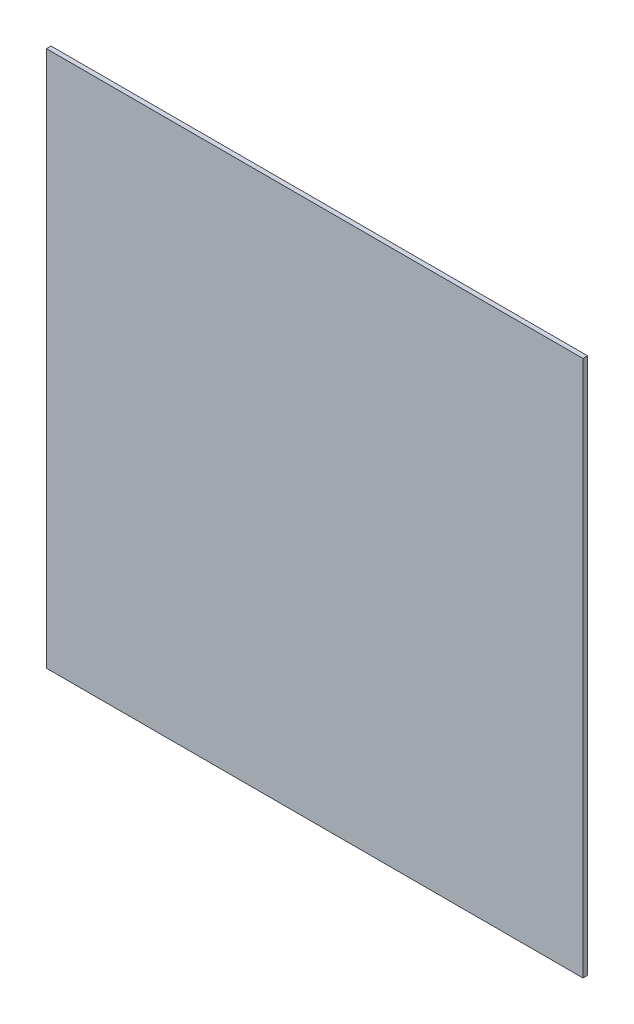
ISO-10303-21;
HEADER;
FILE_DESCRIPTION(('STEP AP214'),'2;1');
FILE_NAME('part.step','',(''),(''),'','','');
FILE_SCHEMA(('AUTOMOTIVE_DESIGN { 1 0 10303 214 1 1 1 1 }'));
ENDSEC;
DATA;
#1=APPLICATION_CONTEXT('core data for automotive mechanical design processes');
#2=APPLICATION_PROTOCOL_DEFINITION('international standard','automotive_design',2000,#1);
#3=PRODUCT_CONTEXT('',#1,'mechanical');
#4=PRODUCT('Part','Part','',(#3));
#5=PRODUCT_RELATED_PRODUCT_CATEGORY('part','',(#4));
#6=PRODUCT_DEFINITION_FORMATION('','',#4);
#7=PRODUCT_DEFINITION_CONTEXT('part definition',#1,'design');
#8=PRODUCT_DEFINITION('design','',#6,#7);
#9=PRODUCT_DEFINITION_SHAPE('','',#8);
#10=(LENGTH_UNIT() NAMED_UNIT(*) SI_UNIT(.MILLI.,.METRE.));
#11=(NAMED_UNIT(*) PLANE_ANGLE_UNIT() SI_UNIT($,.RADIAN.));
#12=(NAMED_UNIT(*) SI_UNIT($,.STERADIAN.) SOLID_ANGLE_UNIT());
#13=UNCERTAINTY_MEASURE_WITH_UNIT(LENGTH_MEASURE(1.E-05),#10,'distance_accuracy_value','');
#14=(GEOMETRIC_REPRESENTATION_CONTEXT(3) GLOBAL_UNCERTAINTY_ASSIGNED_CONTEXT((#13)) GLOBAL_UNIT_ASSIGNED_CONTEXT((#10,
#11,#12)) REPRESENTATION_CONTEXT('',''));
#15=CARTESIAN_POINT('',(0.,0.,0.));
#16=DIRECTION('',(0.,0.,1.));
#17=DIRECTION('',(1.,0.,0.));
#18=AXIS2_PLACEMENT_3D('',#15,#16,#17);
#19=CARTESIAN_POINT('',(1450.,-1450.,25.));
#20=DIRECTION('',(-1.,0.,0.));
#21=DIRECTION('',(0.,0.,1.));
#22=AXIS2_PLACEMENT_3D('',#19,#20,#21);
#23=PLANE('',#22);
#24=DIRECTION('',(0.,1.,0.));
#25=VECTOR('',#24,1.);
#26=CARTESIAN_POINT('',(1450.,-1450.,0.));
#27=LINE('',#26,#25);
#28=CARTESIAN_POINT('',(1450.,-1450.,0.));
#29=VERTEX_POINT('',#28);
#30=CARTESIAN_POINT('',(1450.,1450.,0.));
#31=VERTEX_POINT('',#30);
#32=EDGE_CURVE('E113',#29,#31,#27,.T.);
#33=ORIENTED_EDGE('',*,*,#32,.T.);
#34=DIRECTION('',(0.,0.,-1.));
#35=VECTOR('',#34,1.);
#36=CARTESIAN_POINT('',(1450.,1450.,25.));
#37=LINE('',#36,#35);
#38=CARTESIAN_POINT('',(1450.,1450.,25.));
#39=VERTEX_POINT('',#38);
#40=EDGE_CURVE('E11',#39,#31,#37,.T.);
#41=ORIENTED_EDGE('',*,*,#40,.F.);
#42=DIRECTION('',(0.,1.,0.));
#43=VECTOR('',#42,1.);
#44=CARTESIAN_POINT('',(1450.,-1450.,25.));
#45=LINE('',#44,#43);
#46=CARTESIAN_POINT('',(1450.,-1450.,25.));
#47=VERTEX_POINT('',#46);
#48=EDGE_CURVE('E97',#47,#39,#45,.T.);
#49=ORIENTED_EDGE('',*,*,#48,.F.);
#50=DIRECTION('',(0.,0.,-1.));
#51=VECTOR('',#50,1.);
#52=CARTESIAN_POINT('',(1450.,-1450.,25.));
#53=LINE('',#52,#51);
#54=EDGE_CURVE('E109',#47,#29,#53,.T.);
#55=ORIENTED_EDGE('',*,*,#54,.T.);
#56=EDGE_LOOP('',(#33,#41,#49,#55));
#57=FACE_BOUND('',#56,.T.);
#58=ADVANCED_FACE('F45',(#57),#23,.F.);
#59=CARTESIAN_POINT('',(-1450.,1450.,25.));
#60=DIRECTION('',(0.,-1.,0.));
#61=DIRECTION('',(0.,0.,-1.));
#62=AXIS2_PLACEMENT_3D('',#59,#60,#61);
#63=PLANE('',#62);
#64=DIRECTION('',(-1.,0.,0.));
#65=VECTOR('',#64,1.);
#66=CARTESIAN_POINT('',(-1450.,1450.,0.));
#67=LINE('',#66,#65);
#68=CARTESIAN_POINT('',(-1450.,1450.,0.));
#69=VERTEX_POINT('',#68);
#70=EDGE_CURVE('E102',#31,#69,#67,.T.);
#71=ORIENTED_EDGE('',*,*,#70,.T.);
#72=DIRECTION('',(0.,0.,-1.));
#73=VECTOR('',#72,1.);
#74=CARTESIAN_POINT('',(-1450.,1450.,25.));
#75=LINE('',#74,#73);
#76=CARTESIAN_POINT('',(-1450.,1450.,25.));
#77=VERTEX_POINT('',#76);
#78=EDGE_CURVE('E54',#77,#69,#75,.T.);
#79=ORIENTED_EDGE('',*,*,#78,.F.);
#80=DIRECTION('',(-1.,0.,0.));
#81=VECTOR('',#80,1.);
#82=CARTESIAN_POINT('',(-1450.,1450.,25.));
#83=LINE('',#82,#81);
#84=EDGE_CURVE('E92',#39,#77,#83,.T.);
#85=ORIENTED_EDGE('',*,*,#84,.F.);
#86=ORIENTED_EDGE('',*,*,#40,.T.);
#87=EDGE_LOOP('',(#71,#79,#85,#86));
#88=FACE_BOUND('',#87,.T.);
#89=ADVANCED_FACE('F101',(#88),#63,.F.);
#90=CARTESIAN_POINT('',(-1450.,-1450.,25.));
#91=DIRECTION('',(1.,0.,0.));
#92=DIRECTION('',(0.,0.,-1.));
#93=AXIS2_PLACEMENT_3D('',#90,#91,#92);
#94=PLANE('',#93);
#95=DIRECTION('',(0.,-1.,0.));
#96=VECTOR('',#95,1.);
#97=CARTESIAN_POINT('',(-1450.,-1450.,0.));
#98=LINE('',#97,#96);
#99=CARTESIAN_POINT('',(-1450.,-1450.,0.));
#100=VERTEX_POINT('',#99);
#101=EDGE_CURVE('E79',#69,#100,#98,.T.);
#102=ORIENTED_EDGE('',*,*,#101,.T.);
#103=DIRECTION('',(0.,0.,-1.));
#104=VECTOR('',#103,1.);
#105=CARTESIAN_POINT('',(-1450.,-1450.,25.));
#106=LINE('',#105,#104);
#107=CARTESIAN_POINT('',(-1450.,-1450.,25.));
#108=VERTEX_POINT('',#107);
#109=EDGE_CURVE('E104',#108,#100,#106,.T.);
#110=ORIENTED_EDGE('',*,*,#109,.F.);
#111=DIRECTION('',(0.,-1.,0.));
#112=VECTOR('',#111,1.);
#113=CARTESIAN_POINT('',(-1450.,-1450.,25.));
#114=LINE('',#113,#112);
#115=EDGE_CURVE('E95',#77,#108,#114,.T.);
#116=ORIENTED_EDGE('',*,*,#115,.F.);
#117=ORIENTED_EDGE('',*,*,#78,.T.);
#118=EDGE_LOOP('',(#102,#110,#116,#117));
#119=FACE_BOUND('',#118,.T.);
#120=ADVANCED_FACE('F105',(#119),#94,.F.);
#121=CARTESIAN_POINT('',(-1450.,-1450.,25.));
#122=DIRECTION('',(0.,1.,0.));
#123=DIRECTION('',(0.,0.,1.));
#124=AXIS2_PLACEMENT_3D('',#121,#122,#123);
#125=PLANE('',#124);
#126=DIRECTION('',(1.,0.,0.));
#127=VECTOR('',#126,1.);
#128=CARTESIAN_POINT('',(-1450.,-1450.,0.));
#129=LINE('',#128,#127);
#130=EDGE_CURVE('E85',#100,#29,#129,.T.);
#131=ORIENTED_EDGE('',*,*,#130,.T.);
#132=ORIENTED_EDGE('',*,*,#54,.F.);
#133=DIRECTION('',(1.,0.,0.));
#134=VECTOR('',#133,1.);
#135=CARTESIAN_POINT('',(-1450.,-1450.,25.));
#136=LINE('',#135,#134);
#137=EDGE_CURVE('E62',#108,#47,#136,.T.);
#138=ORIENTED_EDGE('',*,*,#137,.F.);
#139=ORIENTED_EDGE('',*,*,#109,.T.);
#140=EDGE_LOOP('',(#131,#132,#138,#139));
#141=FACE_BOUND('',#140,.T.);
#142=ADVANCED_FACE('F126',(#141),#125,.F.);
#143=CARTESIAN_POINT('',(0.,0.,25.));
#144=DIRECTION('',(0.,0.,-1.));
#145=DIRECTION('',(-1.,0.,0.));
#146=AXIS2_PLACEMENT_3D('',#143,#144,#145);
#147=PLANE('',#146);
#148=ORIENTED_EDGE('',*,*,#48,.T.);
#149=ORIENTED_EDGE('',*,*,#84,.T.);
#150=ORIENTED_EDGE('',*,*,#115,.T.);
#151=ORIENTED_EDGE('',*,*,#137,.T.);
#152=EDGE_LOOP('',(#148,#149,#150,#151));
#153=FACE_BOUND('',#152,.T.);
#154=ADVANCED_FACE('F93',(#153),#147,.F.);
#155=CARTESIAN_POINT('',(0.,0.,0.));
#156=DIRECTION('',(0.,0.,-1.));
#157=DIRECTION('',(-1.,0.,0.));
#158=AXIS2_PLACEMENT_3D('',#155,#156,#157);
#159=PLANE('',#158);
#160=ORIENTED_EDGE('',*,*,#32,.F.);
#161=ORIENTED_EDGE('',*,*,#130,.F.);
#162=ORIENTED_EDGE('',*,*,#101,.F.);
#163=ORIENTED_EDGE('',*,*,#70,.F.);
#164=EDGE_LOOP('',(#160,#161,#162,#163));
#165=FACE_BOUND('',#164,.T.);
#166=ADVANCED_FACE('F129',(#165),#159,.T.);
#167=CLOSED_SHELL('',(#58,#89,#120,#142,#154,#166));
#168=MANIFOLD_SOLID_BREP('B2',#167);
#169=ADVANCED_BREP_SHAPE_REPRESENTATION('',(#18,#168),#14);
#170=SHAPE_DEFINITION_REPRESENTATION(#9,#169);
ENDSEC;
END-ISO-10303-21;
